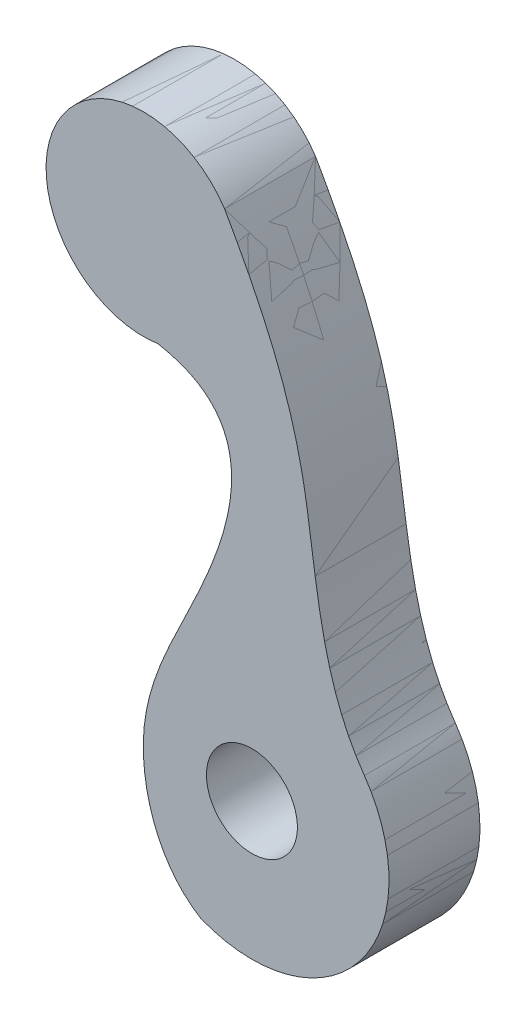
ISO-10303-21;
HEADER;
FILE_DESCRIPTION(('STEP AP214'),'2;1');
FILE_NAME('part.step','',(''),(''),'','','');
FILE_SCHEMA(('AUTOMOTIVE_DESIGN { 1 0 10303 214 1 1 1 1 }'));
ENDSEC;
DATA;
#1=APPLICATION_CONTEXT('core data for automotive mechanical design processes');
#2=APPLICATION_PROTOCOL_DEFINITION('international standard','automotive_design',2000,#1);
#3=PRODUCT_CONTEXT('',#1,'mechanical');
#4=PRODUCT('Part','Part','',(#3));
#5=PRODUCT_RELATED_PRODUCT_CATEGORY('part','',(#4));
#6=PRODUCT_DEFINITION_FORMATION('','',#4);
#7=PRODUCT_DEFINITION_CONTEXT('part definition',#1,'design');
#8=PRODUCT_DEFINITION('design','',#6,#7);
#9=PRODUCT_DEFINITION_SHAPE('','',#8);
#10=(LENGTH_UNIT() NAMED_UNIT(*) SI_UNIT(.MILLI.,.METRE.));
#11=(NAMED_UNIT(*) PLANE_ANGLE_UNIT() SI_UNIT($,.RADIAN.));
#12=(NAMED_UNIT(*) SI_UNIT($,.STERADIAN.) SOLID_ANGLE_UNIT());
#13=UNCERTAINTY_MEASURE_WITH_UNIT(LENGTH_MEASURE(1.E-05),#10,'distance_accuracy_value','');
#14=(GEOMETRIC_REPRESENTATION_CONTEXT(3) GLOBAL_UNCERTAINTY_ASSIGNED_CONTEXT((#13)) GLOBAL_UNIT_ASSIGNED_CONTEXT((#10,
#11,#12)) REPRESENTATION_CONTEXT('',''));
#15=CARTESIAN_POINT('',(0.,0.,0.));
#16=DIRECTION('',(0.,0.,1.));
#17=DIRECTION('',(1.,0.,0.));
#18=AXIS2_PLACEMENT_3D('',#15,#16,#17);
#19=CARTESIAN_POINT('',(-5.16515130119877,19.1929982113175,5.));
#20=CARTESIAN_POINT('',(0.561959138801228,18.1612488153175,5.));
#21=CARTESIAN_POINT('',(-2.02093110019877,9.0935017763175,5.));
#22=CARTESIAN_POINT('',(-7.22017654119877,0.935588497317496,5.));
#23=CARTESIAN_POINT('',(-5.09873430119877,-5.6295416646825,5.));
#24=CARTESIAN_POINT('',(-2.79142352119877,-7.0009586436825,5.));
#25=B_SPLINE_CURVE_WITH_KNOTS('',3,(#19,#20,#21,#22,#23,#24),.UNSPECIFIED.,.F.,.F.,(4,1,1,4),
(0.,0.419324492668433,0.734084210324565,1.),.UNSPECIFIED.);
#26=DIRECTION('',(0.,0.,-1.));
#27=VECTOR('',#26,1.);
#28=SURFACE_OF_LINEAR_EXTRUSION('',#25,#27);
#29=CARTESIAN_POINT('',(-5.16515130119877,19.1929982113175,0.));
#30=CARTESIAN_POINT('',(0.561959138801228,18.1612488153175,0.));
#31=CARTESIAN_POINT('',(-2.02093110019877,9.0935017763175,0.));
#32=CARTESIAN_POINT('',(-7.22017654119877,0.935588497317496,0.));
#33=CARTESIAN_POINT('',(-5.09873430119877,-5.6295416646825,0.));
#34=CARTESIAN_POINT('',(-2.79142352119877,-7.0009586436825,0.));
#35=B_SPLINE_CURVE_WITH_KNOTS('',3,(#29,#30,#31,#32,#33,#34),.UNSPECIFIED.,.F.,.F.,(4,1,1,4),
(0.,0.419324492668433,0.734084210324565,1.),.UNSPECIFIED.);
#36=CARTESIAN_POINT('',(-5.16515130119877,19.1929982113175,0.));
#37=VERTEX_POINT('',#36);
#38=CARTESIAN_POINT('',(-2.79142352119877,-7.0009586436825,0.));
#39=VERTEX_POINT('',#38);
#40=EDGE_CURVE('E54',#37,#39,#35,.T.);
#41=ORIENTED_EDGE('',*,*,#40,.F.);
#42=DIRECTION('',(0.,0.,-1.));
#43=VECTOR('',#42,1.);
#44=CARTESIAN_POINT('',(-5.16515130119877,19.1929982113175,5.));
#45=LINE('',#44,#43);
#46=CARTESIAN_POINT('',(-5.16515130119877,19.1929982113175,5.));
#47=VERTEX_POINT('',#46);
#48=EDGE_CURVE('E61',#47,#37,#45,.T.);
#49=ORIENTED_EDGE('',*,*,#48,.F.);
#50=CARTESIAN_POINT('',(-2.79142352119877,-7.0009586436825,5.));
#51=VERTEX_POINT('',#50);
#52=EDGE_CURVE('E12',#47,#51,#25,.T.);
#53=ORIENTED_EDGE('',*,*,#52,.T.);
#54=DIRECTION('',(0.,0.,-1.));
#55=VECTOR('',#54,1.);
#56=CARTESIAN_POINT('',(-2.79142352119877,-7.0009586436825,5.));
#57=LINE('',#56,#55);
#58=EDGE_CURVE('E48',#51,#39,#57,.T.);
#59=ORIENTED_EDGE('',*,*,#58,.T.);
#60=EDGE_LOOP('',(#41,#49,#53,#59));
#61=FACE_BOUND('',#60,.T.);
#62=ADVANCED_FACE('F45',(#61),#28,.T.);
#63=CARTESIAN_POINT('',(7.08746429600726E-10,7.31984134763608E-10,5.));
#64=DIRECTION('',(0.,0.,-1.));
#65=DIRECTION('',(-1.,0.,0.));
#66=AXIS2_PLACEMENT_3D('',#63,#64,#65);
#67=CYLINDRICAL_SURFACE('',#66,7.53694017618957);
#68=CARTESIAN_POINT('',(7.08746429600726E-10,7.31984134763608E-10,0.));
#69=DIRECTION('',(0.,0.,1.));
#70=DIRECTION('',(1.,0.,0.));
#71=AXIS2_PLACEMENT_3D('',#68,#69,#70);
#72=CIRCLE('',#71,7.53694017618957);
#73=CARTESIAN_POINT('',(6.18403955854113,4.30849416535897,0.));
#74=VERTEX_POINT('',#73);
#75=EDGE_CURVE('E98',#39,#74,#72,.T.);
#76=ORIENTED_EDGE('',*,*,#75,.F.);
#77=ORIENTED_EDGE('',*,*,#58,.F.);
#78=CARTESIAN_POINT('',(7.08746429600726E-10,7.31984134763608E-10,5.));
#79=DIRECTION('',(0.,0.,1.));
#80=DIRECTION('',(1.,0.,0.));
#81=AXIS2_PLACEMENT_3D('',#78,#79,#80);
#82=CIRCLE('',#81,7.53694017618957);
#83=CARTESIAN_POINT('',(6.18403955854113,4.30849416535897,5.));
#84=VERTEX_POINT('',#83);
#85=EDGE_CURVE('E100',#51,#84,#82,.T.);
#86=ORIENTED_EDGE('',*,*,#85,.T.);
#87=DIRECTION('',(0.,0.,-1.));
#88=VECTOR('',#87,1.);
#89=CARTESIAN_POINT('',(6.18403955854113,4.30849416535897,5.));
#90=LINE('',#89,#88);
#91=EDGE_CURVE('E90',#84,#74,#90,.T.);
#92=ORIENTED_EDGE('',*,*,#91,.T.);
#93=EDGE_LOOP('',(#76,#77,#86,#92));
#94=FACE_BOUND('',#93,.T.);
#95=ADVANCED_FACE('F101',(#94),#67,.F.);
#96=CARTESIAN_POINT('',(6.18403955854113,4.30849416535897,5.));
#97=CARTESIAN_POINT('',(3.61389289354113,7.92952791735897,5.));
#98=CARTESIAN_POINT('',(3.59574488354113,16.916271928359,5.));
#99=CARTESIAN_POINT('',(0.755595427541132,23.472120645359,5.));
#100=CARTESIAN_POINT('',(-1.50239126845887,27.446296254359,5.));
#101=B_SPLINE_CURVE_WITH_KNOTS('',3,(#96,#97,#98,#99,#100),.UNSPECIFIED.,.F.,.F.,(4,1,4),(0.,
0.53151830631891,1.),.UNSPECIFIED.);
#102=DIRECTION('',(0.,0.,-1.));
#103=VECTOR('',#102,1.);
#104=SURFACE_OF_LINEAR_EXTRUSION('',#101,#103);
#105=CARTESIAN_POINT('',(6.18403955854113,4.30849416535897,0.));
#106=CARTESIAN_POINT('',(3.61389289354113,7.92952791735897,0.));
#107=CARTESIAN_POINT('',(3.59574488354113,16.916271928359,0.));
#108=CARTESIAN_POINT('',(0.755595427541132,23.472120645359,0.));
#109=CARTESIAN_POINT('',(-1.50239126845887,27.446296254359,0.));
#110=B_SPLINE_CURVE_WITH_KNOTS('',3,(#105,#106,#107,#108,#109),.UNSPECIFIED.,.F.,.F.,(4,1,4),
(0.,0.53151830631891,1.),.UNSPECIFIED.);
#111=CARTESIAN_POINT('',(-1.50239126845887,27.446296254359,0.));
#112=VERTEX_POINT('',#111);
#113=EDGE_CURVE('E95',#74,#112,#110,.T.);
#114=ORIENTED_EDGE('',*,*,#113,.F.);
#115=ORIENTED_EDGE('',*,*,#91,.F.);
#116=CARTESIAN_POINT('',(-1.50239126845887,27.446296254359,5.));
#117=VERTEX_POINT('',#116);
#118=EDGE_CURVE('E93',#84,#117,#101,.T.);
#119=ORIENTED_EDGE('',*,*,#118,.T.);
#120=DIRECTION('',(0.,0.,-1.));
#121=VECTOR('',#120,1.);
#122=CARTESIAN_POINT('',(-1.50239126845887,27.446296254359,5.));
#123=LINE('',#122,#121);
#124=EDGE_CURVE('E78',#117,#112,#123,.T.);
#125=ORIENTED_EDGE('',*,*,#124,.T.);
#126=EDGE_LOOP('',(#114,#115,#119,#125));
#127=FACE_BOUND('',#126,.T.);
#128=ADVANCED_FACE('F92',(#127),#104,.T.);
#129=CARTESIAN_POINT('',(-5.963706975,24.4867956,5.));
#130=DIRECTION('',(0.,0.,-1.));
#131=DIRECTION('',(-1.,0.,0.));
#132=AXIS2_PLACEMENT_3D('',#129,#130,#131);
#133=CYLINDRICAL_SURFACE('',#132,5.35368863089569);
#134=CARTESIAN_POINT('',(-5.963706975,24.4867956,0.));
#135=DIRECTION('',(0.,0.,1.));
#136=DIRECTION('',(1.,0.,0.));
#137=AXIS2_PLACEMENT_3D('',#134,#135,#136);
#138=CIRCLE('',#137,5.35368863089569);
#139=EDGE_CURVE('E140',#112,#37,#138,.T.);
#140=ORIENTED_EDGE('',*,*,#139,.F.);
#141=ORIENTED_EDGE('',*,*,#124,.F.);
#142=CARTESIAN_POINT('',(-5.963706975,24.4867956,5.));
#143=DIRECTION('',(0.,0.,1.));
#144=DIRECTION('',(1.,0.,0.));
#145=AXIS2_PLACEMENT_3D('',#142,#143,#144);
#146=CIRCLE('',#145,5.35368863089569);
#147=EDGE_CURVE('E114',#117,#47,#146,.T.);
#148=ORIENTED_EDGE('',*,*,#147,.T.);
#149=ORIENTED_EDGE('',*,*,#48,.T.);
#150=EDGE_LOOP('',(#140,#141,#148,#149));
#151=FACE_BOUND('',#150,.T.);
#152=ADVANCED_FACE('F121',(#151),#133,.F.);
#153=OPEN_SHELL('',(#62,#95,#128,#152));
#154=SHELL_BASED_SURFACE_MODEL('B2',(#153));
#155=CARTESIAN_POINT('',(6.18403955854113,4.30849416535897,0.));
#156=CARTESIAN_POINT('',(3.61389289354113,7.92952791735897,0.));
#157=CARTESIAN_POINT('',(3.59574488354113,16.916271928359,0.));
#158=CARTESIAN_POINT('',(0.755595427541132,23.472120645359,0.));
#159=CARTESIAN_POINT('',(-1.50239126845887,27.446296254359,0.));
#160=B_SPLINE_CURVE_WITH_KNOTS('',3,(#155,#156,#157,#158,#159),.UNSPECIFIED.,.F.,.F.,(4,1,4),
(0.,0.53151830631891,1.),.UNSPECIFIED.);
#161=DIRECTION('',(0.,0.,1.));
#162=VECTOR('',#161,1.);
#163=SURFACE_OF_LINEAR_EXTRUSION('',#160,#162);
#164=CARTESIAN_POINT('',(6.18403955854113,4.30849416535897,5.));
#165=CARTESIAN_POINT('',(3.61389289354113,7.92952791735897,5.));
#166=CARTESIAN_POINT('',(3.59574488354113,16.916271928359,5.));
#167=CARTESIAN_POINT('',(0.755595427541132,23.472120645359,5.));
#168=CARTESIAN_POINT('',(-1.50239126845887,27.446296254359,5.));
#169=B_SPLINE_CURVE_WITH_KNOTS('',3,(#164,#165,#166,#167,#168),.UNSPECIFIED.,.F.,.F.,(4,1,4),
(0.,0.53151830631891,1.),.UNSPECIFIED.);
#170=CARTESIAN_POINT('',(6.18403955854113,4.30849416535897,5.));
#171=VERTEX_POINT('',#170);
#172=CARTESIAN_POINT('',(-1.50239126845887,27.446296254359,5.));
#173=VERTEX_POINT('',#172);
#174=EDGE_CURVE('E283',#171,#173,#169,.T.);
#175=ORIENTED_EDGE('',*,*,#174,.F.);
#176=DIRECTION('',(0.,0.,1.));
#177=VECTOR('',#176,1.);
#178=CARTESIAN_POINT('',(6.18403955854113,4.30849416535897,0.));
#179=LINE('',#178,#177);
#180=CARTESIAN_POINT('',(6.18403955854113,4.30849416535897,0.));
#181=VERTEX_POINT('',#180);
#182=EDGE_CURVE('E43',#181,#171,#179,.T.);
#183=ORIENTED_EDGE('',*,*,#182,.F.);
#184=CARTESIAN_POINT('',(-1.50239126845887,27.446296254359,0.));
#185=VERTEX_POINT('',#184);
#186=EDGE_CURVE('E251',#181,#185,#160,.T.);
#187=ORIENTED_EDGE('',*,*,#186,.T.);
#188=DIRECTION('',(0.,0.,1.));
#189=VECTOR('',#188,1.);
#190=CARTESIAN_POINT('',(-1.50239126845887,27.446296254359,0.));
#191=LINE('',#190,#189);
#192=EDGE_CURVE('E196',#185,#173,#191,.T.);
#193=ORIENTED_EDGE('',*,*,#192,.T.);
#194=EDGE_LOOP('',(#175,#183,#187,#193));
#195=FACE_BOUND('',#194,.T.);
#196=ADVANCED_FACE('F192',(#195),#163,.T.);
#197=CARTESIAN_POINT('',(7.08746429600726E-10,7.31984134763608E-10,0.));
#198=DIRECTION('',(0.,0.,1.));
#199=DIRECTION('',(1.,0.,0.));
#200=AXIS2_PLACEMENT_3D('',#197,#198,#199);
#201=CYLINDRICAL_SURFACE('',#200,7.53694017618957);
#202=CARTESIAN_POINT('',(7.08746429600726E-10,7.31984134763608E-10,5.));
#203=DIRECTION('',(0.,0.,1.));
#204=DIRECTION('',(1.,0.,0.));
#205=AXIS2_PLACEMENT_3D('',#202,#203,#204);
#206=CIRCLE('',#205,7.53694017618957);
#207=CARTESIAN_POINT('',(-2.79142352119877,-7.0009586436825,5.));
#208=VERTEX_POINT('',#207);
#209=EDGE_CURVE('E253',#208,#171,#206,.T.);
#210=ORIENTED_EDGE('',*,*,#209,.F.);
#211=DIRECTION('',(0.,0.,1.));
#212=VECTOR('',#211,1.);
#213=CARTESIAN_POINT('',(-2.79142352119877,-7.0009586436825,0.));
#214=LINE('',#213,#212);
#215=CARTESIAN_POINT('',(-2.79142352119877,-7.0009586436825,0.));
#216=VERTEX_POINT('',#215);
#217=EDGE_CURVE('E202',#216,#208,#214,.T.);
#218=ORIENTED_EDGE('',*,*,#217,.F.);
#219=CARTESIAN_POINT('',(7.08746429600726E-10,7.31984134763608E-10,0.));
#220=DIRECTION('',(0.,0.,1.));
#221=DIRECTION('',(1.,0.,0.));
#222=AXIS2_PLACEMENT_3D('',#219,#220,#221);
#223=CIRCLE('',#222,7.53694017618957);
#224=EDGE_CURVE('E248',#216,#181,#223,.T.);
#225=ORIENTED_EDGE('',*,*,#224,.T.);
#226=ORIENTED_EDGE('',*,*,#182,.T.);
#227=EDGE_LOOP('',(#210,#218,#225,#226));
#228=FACE_BOUND('',#227,.T.);
#229=ADVANCED_FACE('F269',(#228),#201,.T.);
#230=CARTESIAN_POINT('',(-5.16515130119877,19.1929982113175,0.));
#231=CARTESIAN_POINT('',(0.561959138801228,18.1612488153175,0.));
#232=CARTESIAN_POINT('',(-2.02093110019877,9.0935017763175,0.));
#233=CARTESIAN_POINT('',(-7.22017654119877,0.935588497317496,0.));
#234=CARTESIAN_POINT('',(-5.09873430119877,-5.6295416646825,0.));
#235=CARTESIAN_POINT('',(-2.79142352119877,-7.0009586436825,0.));
#236=B_SPLINE_CURVE_WITH_KNOTS('',3,(#230,#231,#232,#233,#234,#235),.UNSPECIFIED.,.F.,.F.,(4,1,
1,4),(0.,0.419324492668433,0.734084210324565,1.),.UNSPECIFIED.);
#237=DIRECTION('',(0.,0.,1.));
#238=VECTOR('',#237,1.);
#239=SURFACE_OF_LINEAR_EXTRUSION('',#236,#238);
#240=CARTESIAN_POINT('',(-5.16515130119877,19.1929982113175,5.));
#241=CARTESIAN_POINT('',(0.561959138801228,18.1612488153175,5.));
#242=CARTESIAN_POINT('',(-2.02093110019877,9.0935017763175,5.));
#243=CARTESIAN_POINT('',(-7.22017654119877,0.935588497317496,5.));
#244=CARTESIAN_POINT('',(-5.09873430119877,-5.6295416646825,5.));
#245=CARTESIAN_POINT('',(-2.79142352119877,-7.0009586436825,5.));
#246=B_SPLINE_CURVE_WITH_KNOTS('',3,(#240,#241,#242,#243,#244,#245),.UNSPECIFIED.,.F.,.F.,(4,1,
1,4),(0.,0.419324492668433,0.734084210324565,1.),.UNSPECIFIED.);
#247=CARTESIAN_POINT('',(-5.16515130119877,19.1929982113175,5.));
#248=VERTEX_POINT('',#247);
#249=EDGE_CURVE('E243',#248,#208,#246,.T.);
#250=ORIENTED_EDGE('',*,*,#249,.F.);
#251=DIRECTION('',(0.,0.,1.));
#252=VECTOR('',#251,1.);
#253=CARTESIAN_POINT('',(-5.16515130119877,19.1929982113175,0.));
#254=LINE('',#253,#252);
#255=CARTESIAN_POINT('',(-5.16515130119877,19.1929982113175,0.));
#256=VERTEX_POINT('',#255);
#257=EDGE_CURVE('E238',#256,#248,#254,.T.);
#258=ORIENTED_EDGE('',*,*,#257,.F.);
#259=EDGE_CURVE('E241',#256,#216,#236,.T.);
#260=ORIENTED_EDGE('',*,*,#259,.T.);
#261=ORIENTED_EDGE('',*,*,#217,.T.);
#262=EDGE_LOOP('',(#250,#258,#260,#261));
#263=FACE_BOUND('',#262,.T.);
#264=ADVANCED_FACE('F240',(#263),#239,.T.);
#265=CARTESIAN_POINT('',(-5.963706975,24.4867956,0.));
#266=DIRECTION('',(0.,0.,1.));
#267=DIRECTION('',(1.,0.,0.));
#268=AXIS2_PLACEMENT_3D('',#265,#266,#267);
#269=CYLINDRICAL_SURFACE('',#268,5.35368863089569);
#270=CARTESIAN_POINT('',(-5.963706975,24.4867956,5.));
#271=DIRECTION('',(0.,0.,1.));
#272=DIRECTION('',(1.,0.,0.));
#273=AXIS2_PLACEMENT_3D('',#270,#271,#272);
#274=CIRCLE('',#273,5.35368863089569);
#275=EDGE_CURVE('E286',#173,#248,#274,.T.);
#276=ORIENTED_EDGE('',*,*,#275,.F.);
#277=ORIENTED_EDGE('',*,*,#192,.F.);
#278=CARTESIAN_POINT('',(-5.963706975,24.4867956,0.));
#279=DIRECTION('',(0.,0.,1.));
#280=DIRECTION('',(1.,0.,0.));
#281=AXIS2_PLACEMENT_3D('',#278,#279,#280);
#282=CIRCLE('',#281,5.35368863089569);
#283=EDGE_CURVE('E247',#185,#256,#282,.T.);
#284=ORIENTED_EDGE('',*,*,#283,.T.);
#285=ORIENTED_EDGE('',*,*,#257,.T.);
#286=EDGE_LOOP('',(#276,#277,#284,#285));
#287=FACE_BOUND('',#286,.T.);
#288=ADVANCED_FACE('F250',(#287),#269,.T.);
#289=CARTESIAN_POINT('',(2.93318561872326,16.0615792982247,0.));
#290=DIRECTION('',(0.,0.,1.));
#291=DIRECTION('',(1.,0.,0.));
#292=AXIS2_PLACEMENT_3D('',#289,#290,#291);
#293=PLANE('',#292);
#294=CARTESIAN_POINT('',(7.08746429600726E-10,7.31984134763608E-10,0.));
#295=DIRECTION('',(0.,0.,1.));
#296=DIRECTION('',(-1.,0.,0.));
#297=AXIS2_PLACEMENT_3D('',#294,#295,#296);
#298=CIRCLE('',#297,2.49999999926802);
#299=CARTESIAN_POINT('',(-2.49999999855927,7.31984134763608E-10,0.));
#300=VERTEX_POINT('',#299);
#301=EDGE_CURVE('E287',#300,#300,#298,.T.);
#302=ORIENTED_EDGE('',*,*,#301,.T.);
#303=EDGE_LOOP('',(#302));
#304=FACE_BOUND('',#303,.T.);
#305=ORIENTED_EDGE('',*,*,#186,.F.);
#306=ORIENTED_EDGE('',*,*,#224,.F.);
#307=ORIENTED_EDGE('',*,*,#259,.F.);
#308=ORIENTED_EDGE('',*,*,#283,.F.);
#309=EDGE_LOOP('',(#305,#306,#307,#308));
#310=FACE_BOUND('',#309,.T.);
#311=ADVANCED_FACE('F246',(#304,#310),#293,.F.);
#312=CARTESIAN_POINT('',(2.93318561872326,16.0615792982247,5.));
#313=DIRECTION('',(0.,0.,1.));
#314=DIRECTION('',(1.,0.,0.));
#315=AXIS2_PLACEMENT_3D('',#312,#313,#314);
#316=PLANE('',#315);
#317=CARTESIAN_POINT('',(7.08746429600726E-10,7.31984134763608E-10,5.));
#318=DIRECTION('',(0.,0.,1.));
#319=DIRECTION('',(-1.,0.,0.));
#320=AXIS2_PLACEMENT_3D('',#317,#318,#319);
#321=CIRCLE('',#320,2.49999999926802);
#322=CARTESIAN_POINT('',(-2.49999999855927,7.31984134763608E-10,5.));
#323=VERTEX_POINT('',#322);
#324=EDGE_CURVE('E312',#323,#323,#321,.T.);
#325=ORIENTED_EDGE('',*,*,#324,.F.);
#326=EDGE_LOOP('',(#325));
#327=FACE_BOUND('',#326,.T.);
#328=ORIENTED_EDGE('',*,*,#174,.T.);
#329=ORIENTED_EDGE('',*,*,#275,.T.);
#330=ORIENTED_EDGE('',*,*,#249,.T.);
#331=ORIENTED_EDGE('',*,*,#209,.T.);
#332=EDGE_LOOP('',(#328,#329,#330,#331));
#333=FACE_BOUND('',#332,.T.);
#334=ADVANCED_FACE('F275',(#327,#333),#316,.T.);
#335=CARTESIAN_POINT('',(7.08746429600726E-10,7.31984134763608E-10,0.));
#336=DIRECTION('',(0.,0.,1.));
#337=DIRECTION('',(1.,0.,0.));
#338=AXIS2_PLACEMENT_3D('',#335,#336,#337);
#339=CYLINDRICAL_SURFACE('',#338,2.49999999926802);
#340=ORIENTED_EDGE('',*,*,#301,.F.);
#341=EDGE_LOOP('',(#340));
#342=FACE_BOUND('',#341,.T.);
#343=ORIENTED_EDGE('',*,*,#324,.T.);
#344=EDGE_LOOP('',(#343));
#345=FACE_BOUND('',#344,.T.);
#346=ADVANCED_FACE('F303',(#342,#345),#339,.F.);
#347=CLOSED_SHELL('',(#196,#229,#264,#288,#311,#334,#346));
#348=MANIFOLD_SOLID_BREP('B6',#347);
#349=ADVANCED_BREP_SHAPE_REPRESENTATION('',(#18,#348),#14);
#350=MANIFOLD_SURFACE_SHAPE_REPRESENTATION('',(#18,#154),#14);
#351=SHAPE_REPRESENTATION('',(#18),#14);
#352=SHAPE_DEFINITION_REPRESENTATION(#9,#351);
#353=SHAPE_REPRESENTATION_RELATIONSHIP('','',#351,#349);
#354=SHAPE_REPRESENTATION_RELATIONSHIP('','',#351,#350);
ENDSEC;
END-ISO-10303-21;
